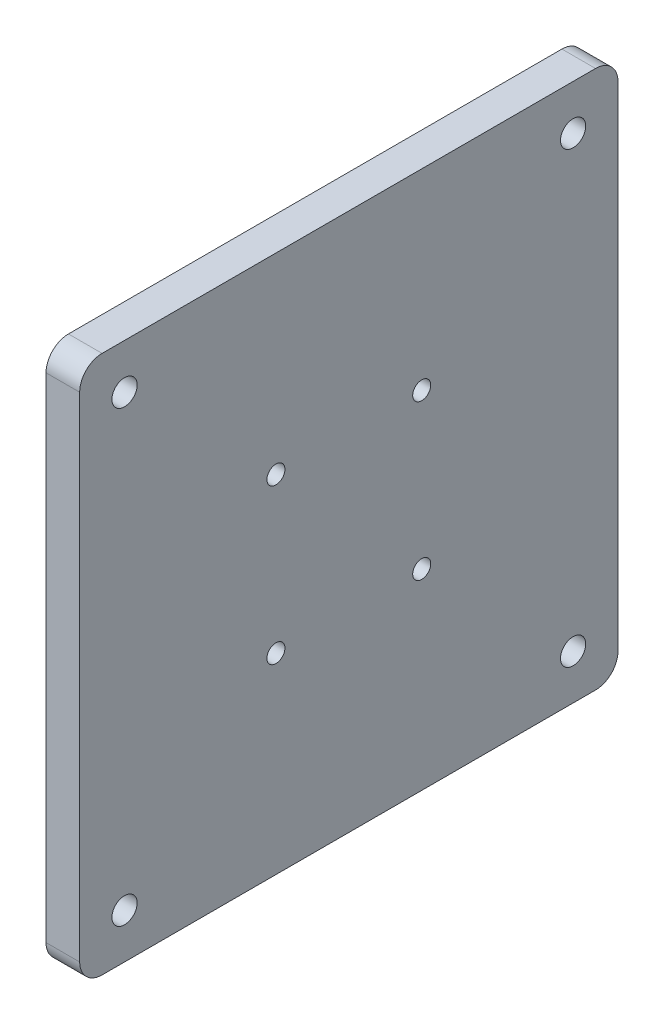
ISO-10303-21;
HEADER;
FILE_DESCRIPTION(('STEP AP214'),'2;1');
FILE_NAME('part.step','',(''),(''),'','','');
FILE_SCHEMA(('AUTOMOTIVE_DESIGN { 1 0 10303 214 1 1 1 1 }'));
ENDSEC;
DATA;
#1=APPLICATION_CONTEXT('core data for automotive mechanical design processes');
#2=APPLICATION_PROTOCOL_DEFINITION('international standard','automotive_design',2000,#1);
#3=PRODUCT_CONTEXT('',#1,'mechanical');
#4=PRODUCT('Part','Part','',(#3));
#5=PRODUCT_RELATED_PRODUCT_CATEGORY('part','',(#4));
#6=PRODUCT_DEFINITION_FORMATION('','',#4);
#7=PRODUCT_DEFINITION_CONTEXT('part definition',#1,'design');
#8=PRODUCT_DEFINITION('design','',#6,#7);
#9=PRODUCT_DEFINITION_SHAPE('','',#8);
#10=(LENGTH_UNIT() NAMED_UNIT(*) SI_UNIT(.MILLI.,.METRE.));
#11=(NAMED_UNIT(*) PLANE_ANGLE_UNIT() SI_UNIT($,.RADIAN.));
#12=(NAMED_UNIT(*) SI_UNIT($,.STERADIAN.) SOLID_ANGLE_UNIT());
#13=UNCERTAINTY_MEASURE_WITH_UNIT(LENGTH_MEASURE(1.E-05),#10,'distance_accuracy_value','');
#14=(GEOMETRIC_REPRESENTATION_CONTEXT(3) GLOBAL_UNCERTAINTY_ASSIGNED_CONTEXT((#13)) GLOBAL_UNIT_ASSIGNED_CONTEXT((#10,
#11,#12)) REPRESENTATION_CONTEXT('',''));
#15=CARTESIAN_POINT('',(0.,0.,0.));
#16=DIRECTION('',(0.,0.,1.));
#17=DIRECTION('',(1.,0.,0.));
#18=AXIS2_PLACEMENT_3D('',#15,#16,#17);
#19=CARTESIAN_POINT('',(9.525,0.,0.));
#20=DIRECTION('',(-1.,0.,0.));
#21=DIRECTION('',(0.,0.,1.));
#22=AXIS2_PLACEMENT_3D('',#19,#20,#21);
#23=PLANE('',#22);
#24=CARTESIAN_POINT('',(9.525,63.5,63.5));
#25=DIRECTION('',(1.,0.,0.));
#26=DIRECTION('',(0.,0.,-1.));
#27=AXIS2_PLACEMENT_3D('',#24,#25,#26);
#28=CIRCLE('',#27,3.57124);
#29=CARTESIAN_POINT('',(9.525,63.5,59.92876));
#30=VERTEX_POINT('',#29);
#31=EDGE_CURVE('E279',#30,#30,#28,.T.);
#32=ORIENTED_EDGE('',*,*,#31,.F.);
#33=EDGE_LOOP('',(#32));
#34=FACE_BOUND('',#33,.T.);
#35=CARTESIAN_POINT('',(9.525,63.5,-63.5));
#36=DIRECTION('',(1.,0.,0.));
#37=DIRECTION('',(0.,0.,-1.));
#38=AXIS2_PLACEMENT_3D('',#35,#36,#37);
#39=CIRCLE('',#38,3.57124);
#40=CARTESIAN_POINT('',(9.525,63.5,-67.07124));
#41=VERTEX_POINT('',#40);
#42=EDGE_CURVE('E283',#41,#41,#39,.T.);
#43=ORIENTED_EDGE('',*,*,#42,.F.);
#44=EDGE_LOOP('',(#43));
#45=FACE_BOUND('',#44,.T.);
#46=CARTESIAN_POINT('',(9.525,-63.5,-63.5));
#47=DIRECTION('',(1.,0.,0.));
#48=DIRECTION('',(0.,0.,-1.));
#49=AXIS2_PLACEMENT_3D('',#46,#47,#48);
#50=CIRCLE('',#49,3.57124);
#51=CARTESIAN_POINT('',(9.525,-63.5,-67.07124));
#52=VERTEX_POINT('',#51);
#53=EDGE_CURVE('E293',#52,#52,#50,.T.);
#54=ORIENTED_EDGE('',*,*,#53,.F.);
#55=EDGE_LOOP('',(#54));
#56=FACE_BOUND('',#55,.T.);
#57=CARTESIAN_POINT('',(9.525,21.9075,20.6375));
#58=DIRECTION('',(1.,0.,0.));
#59=DIRECTION('',(0.,0.,-1.));
#60=AXIS2_PLACEMENT_3D('',#57,#58,#59);
#61=CIRCLE('',#60,2.55269999999999);
#62=CARTESIAN_POINT('',(9.525,21.9075,18.0848));
#63=VERTEX_POINT('',#62);
#64=EDGE_CURVE('E309',#63,#63,#61,.T.);
#65=ORIENTED_EDGE('',*,*,#64,.F.);
#66=EDGE_LOOP('',(#65));
#67=FACE_BOUND('',#66,.T.);
#68=CARTESIAN_POINT('',(9.525,21.9075,-20.6375));
#69=DIRECTION('',(1.,0.,0.));
#70=DIRECTION('',(0.,0.,-1.));
#71=AXIS2_PLACEMENT_3D('',#68,#69,#70);
#72=CIRCLE('',#71,2.55269999999999);
#73=CARTESIAN_POINT('',(9.525,21.9075,-23.1902));
#74=VERTEX_POINT('',#73);
#75=EDGE_CURVE('E317',#74,#74,#72,.T.);
#76=ORIENTED_EDGE('',*,*,#75,.F.);
#77=EDGE_LOOP('',(#76));
#78=FACE_BOUND('',#77,.T.);
#79=CARTESIAN_POINT('',(9.525,-21.9075,-20.6375));
#80=DIRECTION('',(1.,0.,0.));
#81=DIRECTION('',(0.,0.,-1.));
#82=AXIS2_PLACEMENT_3D('',#79,#80,#81);
#83=CIRCLE('',#82,2.55269999999999);
#84=CARTESIAN_POINT('',(9.525,-21.9075,-23.1902));
#85=VERTEX_POINT('',#84);
#86=EDGE_CURVE('E325',#85,#85,#83,.T.);
#87=ORIENTED_EDGE('',*,*,#86,.F.);
#88=EDGE_LOOP('',(#87));
#89=FACE_BOUND('',#88,.T.);
#90=CARTESIAN_POINT('',(9.525,-21.9075,20.6375));
#91=DIRECTION('',(1.,0.,0.));
#92=DIRECTION('',(0.,0.,-1.));
#93=AXIS2_PLACEMENT_3D('',#90,#91,#92);
#94=CIRCLE('',#93,2.55269999999999);
#95=CARTESIAN_POINT('',(9.525,-21.9075,18.0848));
#96=VERTEX_POINT('',#95);
#97=EDGE_CURVE('E333',#96,#96,#94,.T.);
#98=ORIENTED_EDGE('',*,*,#97,.F.);
#99=EDGE_LOOP('',(#98));
#100=FACE_BOUND('',#99,.T.);
#101=DIRECTION('',(0.,-1.,0.));
#102=VECTOR('',#101,1.);
#103=CARTESIAN_POINT('',(9.525,-76.2,76.2));
#104=LINE('',#103,#102);
#105=CARTESIAN_POINT('',(9.525,69.8499999999999,76.2));
#106=VERTEX_POINT('',#105);
#107=CARTESIAN_POINT('',(9.525,-69.85,76.2));
#108=VERTEX_POINT('',#107);
#109=EDGE_CURVE('E197',#106,#108,#104,.T.);
#110=ORIENTED_EDGE('',*,*,#109,.T.);
#111=CARTESIAN_POINT('',(9.525,-69.85,69.85));
#112=DIRECTION('',(-1.,0.,0.));
#113=DIRECTION('',(0.,0.,1.));
#114=AXIS2_PLACEMENT_3D('',#111,#112,#113);
#115=CIRCLE('',#114,6.35);
#116=CARTESIAN_POINT('',(9.525,-76.2,69.85));
#117=VERTEX_POINT('',#116);
#118=EDGE_CURVE('E185',#108,#117,#115,.F.);
#119=ORIENTED_EDGE('',*,*,#118,.T.);
#120=DIRECTION('',(0.,0.,-1.));
#121=VECTOR('',#120,1.);
#122=CARTESIAN_POINT('',(9.525,-76.2,76.2));
#123=LINE('',#122,#121);
#124=CARTESIAN_POINT('',(9.525,-76.2,-69.8499999999999));
#125=VERTEX_POINT('',#124);
#126=EDGE_CURVE('E143',#117,#125,#123,.T.);
#127=ORIENTED_EDGE('',*,*,#126,.T.);
#128=CARTESIAN_POINT('',(9.525,-69.85,-69.85));
#129=DIRECTION('',(-1.,0.,0.));
#130=DIRECTION('',(0.,0.,1.));
#131=AXIS2_PLACEMENT_3D('',#128,#129,#130);
#132=CIRCLE('',#131,6.35);
#133=CARTESIAN_POINT('',(9.525,-69.85,-76.2));
#134=VERTEX_POINT('',#133);
#135=EDGE_CURVE('E182',#125,#134,#132,.F.);
#136=ORIENTED_EDGE('',*,*,#135,.T.);
#137=DIRECTION('',(0.,1.,0.));
#138=VECTOR('',#137,1.);
#139=CARTESIAN_POINT('',(9.525,-76.2,-76.2));
#140=LINE('',#139,#138);
#141=CARTESIAN_POINT('',(9.525,69.8499999999999,-76.2));
#142=VERTEX_POINT('',#141);
#143=EDGE_CURVE('E152',#134,#142,#140,.T.);
#144=ORIENTED_EDGE('',*,*,#143,.T.);
#145=CARTESIAN_POINT('',(9.525,69.85,-69.85));
#146=DIRECTION('',(-1.,0.,0.));
#147=DIRECTION('',(0.,0.,1.));
#148=AXIS2_PLACEMENT_3D('',#145,#146,#147);
#149=CIRCLE('',#148,6.35);
#150=CARTESIAN_POINT('',(9.525,76.2,-69.8499999999999));
#151=VERTEX_POINT('',#150);
#152=EDGE_CURVE('E77',#142,#151,#149,.F.);
#153=ORIENTED_EDGE('',*,*,#152,.T.);
#154=DIRECTION('',(0.,0.,1.));
#155=VECTOR('',#154,1.);
#156=CARTESIAN_POINT('',(9.525,76.2,76.2));
#157=LINE('',#156,#155);
#158=CARTESIAN_POINT('',(9.525,76.2,69.85));
#159=VERTEX_POINT('',#158);
#160=EDGE_CURVE('E157',#151,#159,#157,.T.);
#161=ORIENTED_EDGE('',*,*,#160,.T.);
#162=CARTESIAN_POINT('',(9.525,69.85,69.85));
#163=DIRECTION('',(-1.,0.,0.));
#164=DIRECTION('',(0.,0.,1.));
#165=AXIS2_PLACEMENT_3D('',#162,#163,#164);
#166=CIRCLE('',#165,6.35);
#167=EDGE_CURVE('E177',#159,#106,#166,.F.);
#168=ORIENTED_EDGE('',*,*,#167,.T.);
#169=EDGE_LOOP('',(#110,#119,#127,#136,#144,#153,#161,#168));
#170=FACE_BOUND('',#169,.T.);
#171=CARTESIAN_POINT('',(9.525,-63.5,63.5));
#172=DIRECTION('',(1.,0.,0.));
#173=DIRECTION('',(0.,0.,-1.));
#174=AXIS2_PLACEMENT_3D('',#171,#172,#173);
#175=CIRCLE('',#174,3.57124);
#176=CARTESIAN_POINT('',(9.525,-63.5,59.92876));
#177=VERTEX_POINT('',#176);
#178=EDGE_CURVE('E301',#177,#177,#175,.T.);
#179=ORIENTED_EDGE('',*,*,#178,.F.);
#180=EDGE_LOOP('',(#179));
#181=FACE_BOUND('',#180,.T.);
#182=ADVANCED_FACE('F55',(#34,#45,#56,#67,#78,#89,#100,#170,#181),#23,.F.);
#183=CARTESIAN_POINT('',(0.,0.,0.));
#184=DIRECTION('',(-1.,0.,0.));
#185=DIRECTION('',(0.,0.,1.));
#186=AXIS2_PLACEMENT_3D('',#183,#184,#185);
#187=PLANE('',#186);
#188=CARTESIAN_POINT('',(0.,63.5,63.5));
#189=DIRECTION('',(1.,0.,0.));
#190=DIRECTION('',(0.,0.,-1.));
#191=AXIS2_PLACEMENT_3D('',#188,#189,#190);
#192=CIRCLE('',#191,3.57124);
#193=CARTESIAN_POINT('',(0.,63.5,59.92876));
#194=VERTEX_POINT('',#193);
#195=EDGE_CURVE('E277',#194,#194,#192,.T.);
#196=ORIENTED_EDGE('',*,*,#195,.T.);
#197=EDGE_LOOP('',(#196));
#198=FACE_BOUND('',#197,.T.);
#199=CARTESIAN_POINT('',(0.,63.5,-63.5));
#200=DIRECTION('',(1.,0.,0.));
#201=DIRECTION('',(0.,0.,-1.));
#202=AXIS2_PLACEMENT_3D('',#199,#200,#201);
#203=CIRCLE('',#202,3.57124);
#204=CARTESIAN_POINT('',(0.,63.5,-67.07124));
#205=VERTEX_POINT('',#204);
#206=EDGE_CURVE('E289',#205,#205,#203,.T.);
#207=ORIENTED_EDGE('',*,*,#206,.T.);
#208=EDGE_LOOP('',(#207));
#209=FACE_BOUND('',#208,.T.);
#210=CARTESIAN_POINT('',(0.,-63.5,-63.5));
#211=DIRECTION('',(1.,0.,0.));
#212=DIRECTION('',(0.,0.,-1.));
#213=AXIS2_PLACEMENT_3D('',#210,#211,#212);
#214=CIRCLE('',#213,3.57124);
#215=CARTESIAN_POINT('',(0.,-63.5,-67.07124));
#216=VERTEX_POINT('',#215);
#217=EDGE_CURVE('E297',#216,#216,#214,.T.);
#218=ORIENTED_EDGE('',*,*,#217,.T.);
#219=EDGE_LOOP('',(#218));
#220=FACE_BOUND('',#219,.T.);
#221=DIRECTION('',(0.,0.,-1.));
#222=VECTOR('',#221,1.);
#223=CARTESIAN_POINT('',(0.,-76.2,76.2));
#224=LINE('',#223,#222);
#225=CARTESIAN_POINT('',(0.,-76.2,69.85));
#226=VERTEX_POINT('',#225);
#227=CARTESIAN_POINT('',(0.,-76.2,-69.8499999999999));
#228=VERTEX_POINT('',#227);
#229=EDGE_CURVE('E140',#226,#228,#224,.T.);
#230=ORIENTED_EDGE('',*,*,#229,.F.);
#231=CARTESIAN_POINT('',(0.,-69.85,69.85));
#232=DIRECTION('',(-1.,0.,0.));
#233=DIRECTION('',(0.,0.,1.));
#234=AXIS2_PLACEMENT_3D('',#231,#232,#233);
#235=CIRCLE('',#234,6.35);
#236=CARTESIAN_POINT('',(0.,-69.85,76.2));
#237=VERTEX_POINT('',#236);
#238=EDGE_CURVE('E122',#226,#237,#235,.T.);
#239=ORIENTED_EDGE('',*,*,#238,.T.);
#240=DIRECTION('',(0.,-1.,0.));
#241=VECTOR('',#240,1.);
#242=CARTESIAN_POINT('',(0.,-76.2,76.2));
#243=LINE('',#242,#241);
#244=CARTESIAN_POINT('',(0.,69.8499999999999,76.2));
#245=VERTEX_POINT('',#244);
#246=EDGE_CURVE('E153',#245,#237,#243,.T.);
#247=ORIENTED_EDGE('',*,*,#246,.F.);
#248=CARTESIAN_POINT('',(0.,69.85,69.85));
#249=DIRECTION('',(-1.,0.,0.));
#250=DIRECTION('',(0.,0.,1.));
#251=AXIS2_PLACEMENT_3D('',#248,#249,#250);
#252=CIRCLE('',#251,6.35);
#253=CARTESIAN_POINT('',(0.,76.2,69.85));
#254=VERTEX_POINT('',#253);
#255=EDGE_CURVE('E145',#245,#254,#252,.T.);
#256=ORIENTED_EDGE('',*,*,#255,.T.);
#257=DIRECTION('',(0.,0.,1.));
#258=VECTOR('',#257,1.);
#259=CARTESIAN_POINT('',(0.,76.2,76.2));
#260=LINE('',#259,#258);
#261=CARTESIAN_POINT('',(0.,76.2,-69.8499999999999));
#262=VERTEX_POINT('',#261);
#263=EDGE_CURVE('E159',#262,#254,#260,.T.);
#264=ORIENTED_EDGE('',*,*,#263,.F.);
#265=CARTESIAN_POINT('',(0.,69.85,-69.85));
#266=DIRECTION('',(-1.,0.,0.));
#267=DIRECTION('',(0.,0.,1.));
#268=AXIS2_PLACEMENT_3D('',#265,#266,#267);
#269=CIRCLE('',#268,6.35);
#270=CARTESIAN_POINT('',(0.,69.8499999999999,-76.2));
#271=VERTEX_POINT('',#270);
#272=EDGE_CURVE('E167',#262,#271,#269,.T.);
#273=ORIENTED_EDGE('',*,*,#272,.T.);
#274=DIRECTION('',(0.,1.,0.));
#275=VECTOR('',#274,1.);
#276=CARTESIAN_POINT('',(0.,-76.2,-76.2));
#277=LINE('',#276,#275);
#278=CARTESIAN_POINT('',(0.,-69.85,-76.2));
#279=VERTEX_POINT('',#278);
#280=EDGE_CURVE('E206',#279,#271,#277,.T.);
#281=ORIENTED_EDGE('',*,*,#280,.F.);
#282=CARTESIAN_POINT('',(0.,-69.85,-69.85));
#283=DIRECTION('',(-1.,0.,0.));
#284=DIRECTION('',(0.,0.,1.));
#285=AXIS2_PLACEMENT_3D('',#282,#283,#284);
#286=CIRCLE('',#285,6.35);
#287=EDGE_CURVE('E134',#279,#228,#286,.T.);
#288=ORIENTED_EDGE('',*,*,#287,.T.);
#289=EDGE_LOOP('',(#230,#239,#247,#256,#264,#273,#281,#288));
#290=FACE_BOUND('',#289,.T.);
#291=CARTESIAN_POINT('',(0.,-21.9075,20.6375));
#292=DIRECTION('',(1.,0.,0.));
#293=DIRECTION('',(0.,0.,-1.));
#294=AXIS2_PLACEMENT_3D('',#291,#292,#293);
#295=CIRCLE('',#294,2.55269999999999);
#296=CARTESIAN_POINT('',(0.,-21.9075,18.0848));
#297=VERTEX_POINT('',#296);
#298=EDGE_CURVE('E209',#297,#297,#295,.T.);
#299=ORIENTED_EDGE('',*,*,#298,.T.);
#300=EDGE_LOOP('',(#299));
#301=FACE_BOUND('',#300,.T.);
#302=CARTESIAN_POINT('',(0.,-21.9075,-20.6375));
#303=DIRECTION('',(1.,0.,0.));
#304=DIRECTION('',(0.,0.,-1.));
#305=AXIS2_PLACEMENT_3D('',#302,#303,#304);
#306=CIRCLE('',#305,2.55269999999999);
#307=CARTESIAN_POINT('',(0.,-21.9075,-23.1902));
#308=VERTEX_POINT('',#307);
#309=EDGE_CURVE('E329',#308,#308,#306,.T.);
#310=ORIENTED_EDGE('',*,*,#309,.T.);
#311=EDGE_LOOP('',(#310));
#312=FACE_BOUND('',#311,.T.);
#313=CARTESIAN_POINT('',(0.,21.9075,-20.6375));
#314=DIRECTION('',(1.,0.,0.));
#315=DIRECTION('',(0.,0.,-1.));
#316=AXIS2_PLACEMENT_3D('',#313,#314,#315);
#317=CIRCLE('',#316,2.55269999999999);
#318=CARTESIAN_POINT('',(0.,21.9075,-23.1902));
#319=VERTEX_POINT('',#318);
#320=EDGE_CURVE('E321',#319,#319,#317,.T.);
#321=ORIENTED_EDGE('',*,*,#320,.T.);
#322=EDGE_LOOP('',(#321));
#323=FACE_BOUND('',#322,.T.);
#324=CARTESIAN_POINT('',(0.,21.9075,20.6375));
#325=DIRECTION('',(1.,0.,0.));
#326=DIRECTION('',(0.,0.,-1.));
#327=AXIS2_PLACEMENT_3D('',#324,#325,#326);
#328=CIRCLE('',#327,2.55269999999999);
#329=CARTESIAN_POINT('',(0.,21.9075,18.0848));
#330=VERTEX_POINT('',#329);
#331=EDGE_CURVE('E313',#330,#330,#328,.T.);
#332=ORIENTED_EDGE('',*,*,#331,.T.);
#333=EDGE_LOOP('',(#332));
#334=FACE_BOUND('',#333,.T.);
#335=CARTESIAN_POINT('',(0.,-63.5,63.5));
#336=DIRECTION('',(1.,0.,0.));
#337=DIRECTION('',(0.,0.,-1.));
#338=AXIS2_PLACEMENT_3D('',#335,#336,#337);
#339=CIRCLE('',#338,3.57124);
#340=CARTESIAN_POINT('',(0.,-63.5,59.92876));
#341=VERTEX_POINT('',#340);
#342=EDGE_CURVE('E305',#341,#341,#339,.T.);
#343=ORIENTED_EDGE('',*,*,#342,.T.);
#344=EDGE_LOOP('',(#343));
#345=FACE_BOUND('',#344,.T.);
#346=ADVANCED_FACE('F148',(#198,#209,#220,#290,#301,#312,#323,#334,#345),#187,.T.);
#347=CARTESIAN_POINT('',(9.525,-76.2,-76.2));
#348=DIRECTION('',(0.,0.,1.));
#349=DIRECTION('',(1.,0.,0.));
#350=AXIS2_PLACEMENT_3D('',#347,#348,#349);
#351=PLANE('',#350);
#352=ORIENTED_EDGE('',*,*,#143,.F.);
#353=DIRECTION('',(-1.,0.,0.));
#354=VECTOR('',#353,1.);
#355=CARTESIAN_POINT('',(9.525,-69.85,-76.2));
#356=LINE('',#355,#354);
#357=EDGE_CURVE('E191',#134,#279,#356,.T.);
#358=ORIENTED_EDGE('',*,*,#357,.T.);
#359=ORIENTED_EDGE('',*,*,#280,.T.);
#360=DIRECTION('',(-1.,0.,0.));
#361=VECTOR('',#360,1.);
#362=CARTESIAN_POINT('',(9.525,69.85,-76.2));
#363=LINE('',#362,#361);
#364=EDGE_CURVE('E188',#271,#142,#363,.F.);
#365=ORIENTED_EDGE('',*,*,#364,.T.);
#366=EDGE_LOOP('',(#352,#358,#359,#365));
#367=FACE_BOUND('',#366,.T.);
#368=ADVANCED_FACE('F228',(#367),#351,.F.);
#369=CARTESIAN_POINT('',(9.525,76.2,76.2));
#370=DIRECTION('',(0.,-1.,0.));
#371=DIRECTION('',(0.,0.,-1.));
#372=AXIS2_PLACEMENT_3D('',#369,#370,#371);
#373=PLANE('',#372);
#374=ORIENTED_EDGE('',*,*,#160,.F.);
#375=DIRECTION('',(-1.,0.,0.));
#376=VECTOR('',#375,1.);
#377=CARTESIAN_POINT('',(9.525,76.2,-69.85));
#378=LINE('',#377,#376);
#379=EDGE_CURVE('E11',#151,#262,#378,.T.);
#380=ORIENTED_EDGE('',*,*,#379,.T.);
#381=ORIENTED_EDGE('',*,*,#263,.T.);
#382=DIRECTION('',(-1.,0.,0.));
#383=VECTOR('',#382,1.);
#384=CARTESIAN_POINT('',(9.525,76.2,69.85));
#385=LINE('',#384,#383);
#386=EDGE_CURVE('E64',#254,#159,#385,.F.);
#387=ORIENTED_EDGE('',*,*,#386,.T.);
#388=EDGE_LOOP('',(#374,#380,#381,#387));
#389=FACE_BOUND('',#388,.T.);
#390=ADVANCED_FACE('F212',(#389),#373,.F.);
#391=CARTESIAN_POINT('',(9.525,-76.2,76.2));
#392=DIRECTION('',(0.,0.,-1.));
#393=DIRECTION('',(-1.,0.,0.));
#394=AXIS2_PLACEMENT_3D('',#391,#392,#393);
#395=PLANE('',#394);
#396=ORIENTED_EDGE('',*,*,#246,.T.);
#397=DIRECTION('',(-1.,0.,0.));
#398=VECTOR('',#397,1.);
#399=CARTESIAN_POINT('',(9.525,-69.85,76.2));
#400=LINE('',#399,#398);
#401=EDGE_CURVE('E127',#237,#108,#400,.F.);
#402=ORIENTED_EDGE('',*,*,#401,.T.);
#403=ORIENTED_EDGE('',*,*,#109,.F.);
#404=DIRECTION('',(-1.,0.,0.));
#405=VECTOR('',#404,1.);
#406=CARTESIAN_POINT('',(9.525,69.85,76.2));
#407=LINE('',#406,#405);
#408=EDGE_CURVE('E133',#106,#245,#407,.T.);
#409=ORIENTED_EDGE('',*,*,#408,.T.);
#410=EDGE_LOOP('',(#396,#402,#403,#409));
#411=FACE_BOUND('',#410,.T.);
#412=ADVANCED_FACE('F219',(#411),#395,.F.);
#413=CARTESIAN_POINT('',(9.525,-76.2,76.2));
#414=DIRECTION('',(0.,1.,0.));
#415=DIRECTION('',(0.,0.,1.));
#416=AXIS2_PLACEMENT_3D('',#413,#414,#415);
#417=PLANE('',#416);
#418=ORIENTED_EDGE('',*,*,#126,.F.);
#419=DIRECTION('',(-1.,0.,0.));
#420=VECTOR('',#419,1.);
#421=CARTESIAN_POINT('',(9.525,-76.2,69.85));
#422=LINE('',#421,#420);
#423=EDGE_CURVE('E126',#117,#226,#422,.T.);
#424=ORIENTED_EDGE('',*,*,#423,.T.);
#425=ORIENTED_EDGE('',*,*,#229,.T.);
#426=DIRECTION('',(-1.,0.,0.));
#427=VECTOR('',#426,1.);
#428=CARTESIAN_POINT('',(9.525,-76.2,-69.85));
#429=LINE('',#428,#427);
#430=EDGE_CURVE('E146',#228,#125,#429,.F.);
#431=ORIENTED_EDGE('',*,*,#430,.T.);
#432=EDGE_LOOP('',(#418,#424,#425,#431));
#433=FACE_BOUND('',#432,.T.);
#434=ADVANCED_FACE('F139',(#433),#417,.F.);
#435=CARTESIAN_POINT('',(9.525,-21.9075,20.6375));
#436=DIRECTION('',(1.,0.,0.));
#437=DIRECTION('',(0.,0.,-1.));
#438=AXIS2_PLACEMENT_3D('',#435,#436,#437);
#439=CYLINDRICAL_SURFACE('',#438,2.55269999999999);
#440=ORIENTED_EDGE('',*,*,#298,.F.);
#441=EDGE_LOOP('',(#440));
#442=FACE_BOUND('',#441,.T.);
#443=ORIENTED_EDGE('',*,*,#97,.T.);
#444=EDGE_LOOP('',(#443));
#445=FACE_BOUND('',#444,.T.);
#446=ADVANCED_FACE('F226',(#442,#445),#439,.F.);
#447=CARTESIAN_POINT('',(9.525,-21.9075,-20.6375));
#448=DIRECTION('',(1.,0.,0.));
#449=DIRECTION('',(0.,0.,-1.));
#450=AXIS2_PLACEMENT_3D('',#447,#448,#449);
#451=CYLINDRICAL_SURFACE('',#450,2.55269999999999);
#452=ORIENTED_EDGE('',*,*,#309,.F.);
#453=EDGE_LOOP('',(#452));
#454=FACE_BOUND('',#453,.T.);
#455=ORIENTED_EDGE('',*,*,#86,.T.);
#456=EDGE_LOOP('',(#455));
#457=FACE_BOUND('',#456,.T.);
#458=ADVANCED_FACE('F244',(#454,#457),#451,.F.);
#459=CARTESIAN_POINT('',(9.525,21.9075,-20.6375));
#460=DIRECTION('',(1.,0.,0.));
#461=DIRECTION('',(0.,0.,-1.));
#462=AXIS2_PLACEMENT_3D('',#459,#460,#461);
#463=CYLINDRICAL_SURFACE('',#462,2.55269999999999);
#464=ORIENTED_EDGE('',*,*,#320,.F.);
#465=EDGE_LOOP('',(#464));
#466=FACE_BOUND('',#465,.T.);
#467=ORIENTED_EDGE('',*,*,#75,.T.);
#468=EDGE_LOOP('',(#467));
#469=FACE_BOUND('',#468,.T.);
#470=ADVANCED_FACE('F248',(#466,#469),#463,.F.);
#471=CARTESIAN_POINT('',(9.525,21.9075,20.6375));
#472=DIRECTION('',(1.,0.,0.));
#473=DIRECTION('',(0.,0.,-1.));
#474=AXIS2_PLACEMENT_3D('',#471,#472,#473);
#475=CYLINDRICAL_SURFACE('',#474,2.55269999999999);
#476=ORIENTED_EDGE('',*,*,#331,.F.);
#477=EDGE_LOOP('',(#476));
#478=FACE_BOUND('',#477,.T.);
#479=ORIENTED_EDGE('',*,*,#64,.T.);
#480=EDGE_LOOP('',(#479));
#481=FACE_BOUND('',#480,.T.);
#482=ADVANCED_FACE('F252',(#478,#481),#475,.F.);
#483=CARTESIAN_POINT('',(9.525,-69.85,69.85));
#484=DIRECTION('',(-1.,0.,0.));
#485=DIRECTION('',(0.,0.,1.));
#486=AXIS2_PLACEMENT_3D('',#483,#484,#485);
#487=CYLINDRICAL_SURFACE('',#486,6.35);
#488=ORIENTED_EDGE('',*,*,#118,.F.);
#489=ORIENTED_EDGE('',*,*,#401,.F.);
#490=ORIENTED_EDGE('',*,*,#238,.F.);
#491=ORIENTED_EDGE('',*,*,#423,.F.);
#492=EDGE_LOOP('',(#488,#489,#490,#491));
#493=FACE_BOUND('',#492,.T.);
#494=ADVANCED_FACE('F125',(#493),#487,.T.);
#495=CARTESIAN_POINT('',(9.525,-69.85,-69.85));
#496=DIRECTION('',(-1.,0.,0.));
#497=DIRECTION('',(0.,0.,1.));
#498=AXIS2_PLACEMENT_3D('',#495,#496,#497);
#499=CYLINDRICAL_SURFACE('',#498,6.35);
#500=ORIENTED_EDGE('',*,*,#135,.F.);
#501=ORIENTED_EDGE('',*,*,#430,.F.);
#502=ORIENTED_EDGE('',*,*,#287,.F.);
#503=ORIENTED_EDGE('',*,*,#357,.F.);
#504=EDGE_LOOP('',(#500,#501,#502,#503));
#505=FACE_BOUND('',#504,.T.);
#506=ADVANCED_FACE('F496',(#505),#499,.T.);
#507=CARTESIAN_POINT('',(9.525,69.85,-69.85));
#508=DIRECTION('',(-1.,0.,0.));
#509=DIRECTION('',(0.,0.,1.));
#510=AXIS2_PLACEMENT_3D('',#507,#508,#509);
#511=CYLINDRICAL_SURFACE('',#510,6.35);
#512=ORIENTED_EDGE('',*,*,#152,.F.);
#513=ORIENTED_EDGE('',*,*,#364,.F.);
#514=ORIENTED_EDGE('',*,*,#272,.F.);
#515=ORIENTED_EDGE('',*,*,#379,.F.);
#516=EDGE_LOOP('',(#512,#513,#514,#515));
#517=FACE_BOUND('',#516,.T.);
#518=ADVANCED_FACE('F503',(#517),#511,.T.);
#519=CARTESIAN_POINT('',(9.525,69.85,69.85));
#520=DIRECTION('',(-1.,0.,0.));
#521=DIRECTION('',(0.,0.,1.));
#522=AXIS2_PLACEMENT_3D('',#519,#520,#521);
#523=CYLINDRICAL_SURFACE('',#522,6.35);
#524=ORIENTED_EDGE('',*,*,#167,.F.);
#525=ORIENTED_EDGE('',*,*,#386,.F.);
#526=ORIENTED_EDGE('',*,*,#255,.F.);
#527=ORIENTED_EDGE('',*,*,#408,.F.);
#528=EDGE_LOOP('',(#524,#525,#526,#527));
#529=FACE_BOUND('',#528,.T.);
#530=ADVANCED_FACE('F57',(#529),#523,.T.);
#531=CARTESIAN_POINT('',(9.525,-63.5,63.5));
#532=DIRECTION('',(1.,0.,0.));
#533=DIRECTION('',(0.,0.,-1.));
#534=AXIS2_PLACEMENT_3D('',#531,#532,#533);
#535=CYLINDRICAL_SURFACE('',#534,3.57124);
#536=ORIENTED_EDGE('',*,*,#342,.F.);
#537=EDGE_LOOP('',(#536));
#538=FACE_BOUND('',#537,.T.);
#539=ORIENTED_EDGE('',*,*,#178,.T.);
#540=EDGE_LOOP('',(#539));
#541=FACE_BOUND('',#540,.T.);
#542=ADVANCED_FACE('F257',(#538,#541),#535,.F.);
#543=CARTESIAN_POINT('',(9.525,-63.5,-63.5));
#544=DIRECTION('',(1.,0.,0.));
#545=DIRECTION('',(0.,0.,-1.));
#546=AXIS2_PLACEMENT_3D('',#543,#544,#545);
#547=CYLINDRICAL_SURFACE('',#546,3.57124);
#548=ORIENTED_EDGE('',*,*,#217,.F.);
#549=EDGE_LOOP('',(#548));
#550=FACE_BOUND('',#549,.T.);
#551=ORIENTED_EDGE('',*,*,#53,.T.);
#552=EDGE_LOOP('',(#551));
#553=FACE_BOUND('',#552,.T.);
#554=ADVANCED_FACE('F260',(#550,#553),#547,.F.);
#555=CARTESIAN_POINT('',(9.525,63.5,-63.5));
#556=DIRECTION('',(1.,0.,0.));
#557=DIRECTION('',(0.,0.,-1.));
#558=AXIS2_PLACEMENT_3D('',#555,#556,#557);
#559=CYLINDRICAL_SURFACE('',#558,3.57124);
#560=ORIENTED_EDGE('',*,*,#206,.F.);
#561=EDGE_LOOP('',(#560));
#562=FACE_BOUND('',#561,.T.);
#563=ORIENTED_EDGE('',*,*,#42,.T.);
#564=EDGE_LOOP('',(#563));
#565=FACE_BOUND('',#564,.T.);
#566=ADVANCED_FACE('F264',(#562,#565),#559,.F.);
#567=CARTESIAN_POINT('',(9.525,63.5,63.5));
#568=DIRECTION('',(1.,0.,0.));
#569=DIRECTION('',(0.,0.,-1.));
#570=AXIS2_PLACEMENT_3D('',#567,#568,#569);
#571=CYLINDRICAL_SURFACE('',#570,3.57124);
#572=ORIENTED_EDGE('',*,*,#195,.F.);
#573=EDGE_LOOP('',(#572));
#574=FACE_BOUND('',#573,.T.);
#575=ORIENTED_EDGE('',*,*,#31,.T.);
#576=EDGE_LOOP('',(#575));
#577=FACE_BOUND('',#576,.T.);
#578=ADVANCED_FACE('F268',(#574,#577),#571,.F.);
#579=CLOSED_SHELL('',(#182,#346,#368,#390,#412,#434,#446,#458,#470,#482,#494,#506,#518,#530,
#542,#554,#566,#578));
#580=MANIFOLD_SOLID_BREP('B2',#579);
#581=ADVANCED_BREP_SHAPE_REPRESENTATION('',(#18,#580),#14);
#582=SHAPE_DEFINITION_REPRESENTATION(#9,#581);
ENDSEC;
END-ISO-10303-21;
